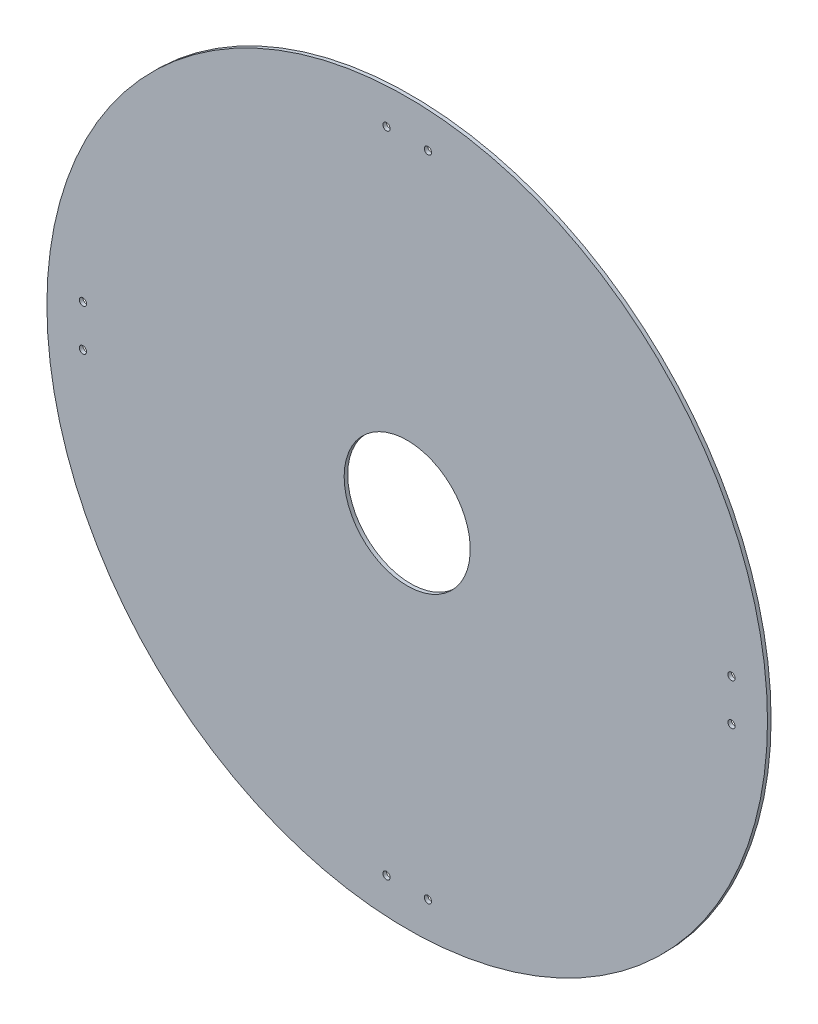
ISO-10303-21;
HEADER;
FILE_DESCRIPTION(('STEP AP214'),'2;1');
FILE_NAME('part.step','',(''),(''),'','','');
FILE_SCHEMA(('AUTOMOTIVE_DESIGN { 1 0 10303 214 1 1 1 1 }'));
ENDSEC;
DATA;
#1=APPLICATION_CONTEXT('core data for automotive mechanical design processes');
#2=APPLICATION_PROTOCOL_DEFINITION('international standard','automotive_design',2000,#1);
#3=PRODUCT_CONTEXT('',#1,'mechanical');
#4=PRODUCT('Part','Part','',(#3));
#5=PRODUCT_RELATED_PRODUCT_CATEGORY('part','',(#4));
#6=PRODUCT_DEFINITION_FORMATION('','',#4);
#7=PRODUCT_DEFINITION_CONTEXT('part definition',#1,'design');
#8=PRODUCT_DEFINITION('design','',#6,#7);
#9=PRODUCT_DEFINITION_SHAPE('','',#8);
#10=(LENGTH_UNIT() NAMED_UNIT(*) SI_UNIT(.MILLI.,.METRE.));
#11=(NAMED_UNIT(*) PLANE_ANGLE_UNIT() SI_UNIT($,.RADIAN.));
#12=(NAMED_UNIT(*) SI_UNIT($,.STERADIAN.) SOLID_ANGLE_UNIT());
#13=UNCERTAINTY_MEASURE_WITH_UNIT(LENGTH_MEASURE(1.E-05),#10,'distance_accuracy_value','');
#14=(GEOMETRIC_REPRESENTATION_CONTEXT(3) GLOBAL_UNCERTAINTY_ASSIGNED_CONTEXT((#13)) GLOBAL_UNIT_ASSIGNED_CONTEXT((#10,
#11,#12)) REPRESENTATION_CONTEXT('',''));
#15=CARTESIAN_POINT('',(0.,0.,0.));
#16=DIRECTION('',(0.,0.,1.));
#17=DIRECTION('',(1.,0.,0.));
#18=AXIS2_PLACEMENT_3D('',#15,#16,#17);
#19=CARTESIAN_POINT('',(0.,0.,2.));
#20=DIRECTION('',(0.,0.,-1.));
#21=DIRECTION('',(-1.,0.,0.));
#22=AXIS2_PLACEMENT_3D('',#19,#20,#21);
#23=CYLINDRICAL_SURFACE('',#22,200.);
#24=CARTESIAN_POINT('',(0.,0.,2.));
#25=DIRECTION('',(0.,0.,1.));
#26=DIRECTION('',(1.,0.,0.));
#27=AXIS2_PLACEMENT_3D('',#24,#25,#26);
#28=CIRCLE('',#27,200.);
#29=CARTESIAN_POINT('',(200.,0.,2.));
#30=VERTEX_POINT('',#29);
#31=EDGE_CURVE('E12',#30,#30,#28,.T.);
#32=ORIENTED_EDGE('',*,*,#31,.F.);
#33=EDGE_LOOP('',(#32));
#34=FACE_BOUND('',#33,.T.);
#35=CARTESIAN_POINT('',(0.,0.,0.));
#36=DIRECTION('',(0.,0.,1.));
#37=DIRECTION('',(1.,0.,0.));
#38=AXIS2_PLACEMENT_3D('',#35,#36,#37);
#39=CIRCLE('',#38,200.);
#40=CARTESIAN_POINT('',(200.,0.,0.));
#41=VERTEX_POINT('',#40);
#42=EDGE_CURVE('E47',#41,#41,#39,.T.);
#43=ORIENTED_EDGE('',*,*,#42,.T.);
#44=EDGE_LOOP('',(#43));
#45=FACE_BOUND('',#44,.T.);
#46=ADVANCED_FACE('F44',(#34,#45),#23,.T.);
#47=CARTESIAN_POINT('',(0.,0.,2.));
#48=DIRECTION('',(0.,0.,1.));
#49=DIRECTION('',(1.,0.,0.));
#50=AXIS2_PLACEMENT_3D('',#47,#48,#49);
#51=PLANE('',#50);
#52=CARTESIAN_POINT('',(0.,0.,2.));
#53=DIRECTION('',(0.,0.,-1.));
#54=DIRECTION('',(-1.,0.,0.));
#55=AXIS2_PLACEMENT_3D('',#52,#53,#54);
#56=CIRCLE('',#55,35.);
#57=CARTESIAN_POINT('',(-35.,0.,2.));
#58=VERTEX_POINT('',#57);
#59=EDGE_CURVE('E103',#58,#58,#56,.T.);
#60=ORIENTED_EDGE('',*,*,#59,.T.);
#61=EDGE_LOOP('',(#60));
#62=FACE_BOUND('',#61,.T.);
#63=CARTESIAN_POINT('',(180.,11.5000000000019,2.));
#64=DIRECTION('',(0.,0.,1.));
#65=DIRECTION('',(1.,0.,0.));
#66=AXIS2_PLACEMENT_3D('',#63,#64,#65);
#67=CIRCLE('',#66,2.);
#68=CARTESIAN_POINT('',(182.,11.5000000000019,2.));
#69=VERTEX_POINT('',#68);
#70=EDGE_CURVE('E65',#69,#69,#67,.T.);
#71=ORIENTED_EDGE('',*,*,#70,.F.);
#72=EDGE_LOOP('',(#71));
#73=FACE_BOUND('',#72,.T.);
#74=CARTESIAN_POINT('',(-11.5,-180.,2.));
#75=DIRECTION('',(0.,0.,1.));
#76=DIRECTION('',(1.,0.,0.));
#77=AXIS2_PLACEMENT_3D('',#74,#75,#76);
#78=CIRCLE('',#77,2.);
#79=CARTESIAN_POINT('',(-9.5,-180.,2.));
#80=VERTEX_POINT('',#79);
#81=EDGE_CURVE('E70',#80,#80,#78,.T.);
#82=ORIENTED_EDGE('',*,*,#81,.F.);
#83=EDGE_LOOP('',(#82));
#84=FACE_BOUND('',#83,.T.);
#85=CARTESIAN_POINT('',(11.5,-180.,2.));
#86=DIRECTION('',(0.,0.,1.));
#87=DIRECTION('',(1.,0.,0.));
#88=AXIS2_PLACEMENT_3D('',#85,#86,#87);
#89=CIRCLE('',#88,2.);
#90=CARTESIAN_POINT('',(13.5,-180.,2.));
#91=VERTEX_POINT('',#90);
#92=EDGE_CURVE('E73',#91,#91,#89,.T.);
#93=ORIENTED_EDGE('',*,*,#92,.F.);
#94=EDGE_LOOP('',(#93));
#95=FACE_BOUND('',#94,.T.);
#96=CARTESIAN_POINT('',(-180.,11.4999999999994,2.));
#97=DIRECTION('',(0.,0.,1.));
#98=DIRECTION('',(1.,0.,0.));
#99=AXIS2_PLACEMENT_3D('',#96,#97,#98);
#100=CIRCLE('',#99,2.);
#101=CARTESIAN_POINT('',(-178.,11.4999999999994,2.));
#102=VERTEX_POINT('',#101);
#103=EDGE_CURVE('E76',#102,#102,#100,.T.);
#104=ORIENTED_EDGE('',*,*,#103,.F.);
#105=EDGE_LOOP('',(#104));
#106=FACE_BOUND('',#105,.T.);
#107=CARTESIAN_POINT('',(180.,-11.4999999999981,2.));
#108=DIRECTION('',(0.,0.,1.));
#109=DIRECTION('',(1.,0.,0.));
#110=AXIS2_PLACEMENT_3D('',#107,#108,#109);
#111=CIRCLE('',#110,2.);
#112=CARTESIAN_POINT('',(182.,-11.4999999999981,2.));
#113=VERTEX_POINT('',#112);
#114=EDGE_CURVE('E79',#113,#113,#111,.T.);
#115=ORIENTED_EDGE('',*,*,#114,.F.);
#116=EDGE_LOOP('',(#115));
#117=FACE_BOUND('',#116,.T.);
#118=CARTESIAN_POINT('',(-180.,-11.5000000000006,2.));
#119=DIRECTION('',(0.,0.,1.));
#120=DIRECTION('',(1.,0.,0.));
#121=AXIS2_PLACEMENT_3D('',#118,#119,#120);
#122=CIRCLE('',#121,2.);
#123=CARTESIAN_POINT('',(-178.,-11.5000000000006,2.));
#124=VERTEX_POINT('',#123);
#125=EDGE_CURVE('E82',#124,#124,#122,.T.);
#126=ORIENTED_EDGE('',*,*,#125,.F.);
#127=EDGE_LOOP('',(#126));
#128=FACE_BOUND('',#127,.T.);
#129=CARTESIAN_POINT('',(-11.5,180.,2.));
#130=DIRECTION('',(0.,0.,1.));
#131=DIRECTION('',(1.,0.,0.));
#132=AXIS2_PLACEMENT_3D('',#129,#130,#131);
#133=CIRCLE('',#132,2.);
#134=CARTESIAN_POINT('',(-9.5,180.,2.));
#135=VERTEX_POINT('',#134);
#136=EDGE_CURVE('E54',#135,#135,#133,.T.);
#137=ORIENTED_EDGE('',*,*,#136,.F.);
#138=EDGE_LOOP('',(#137));
#139=FACE_BOUND('',#138,.T.);
#140=CARTESIAN_POINT('',(11.5,180.,2.));
#141=DIRECTION('',(0.,0.,1.));
#142=DIRECTION('',(1.,0.,0.));
#143=AXIS2_PLACEMENT_3D('',#140,#141,#142);
#144=CIRCLE('',#143,2.);
#145=CARTESIAN_POINT('',(13.5,180.,2.));
#146=VERTEX_POINT('',#145);
#147=EDGE_CURVE('E58',#146,#146,#144,.T.);
#148=ORIENTED_EDGE('',*,*,#147,.F.);
#149=EDGE_LOOP('',(#148));
#150=FACE_BOUND('',#149,.T.);
#151=ORIENTED_EDGE('',*,*,#31,.T.);
#152=EDGE_LOOP('',(#151));
#153=FACE_BOUND('',#152,.T.);
#154=ADVANCED_FACE('F110',(#62,#73,#84,#95,#106,#117,#128,#139,#150,#153),#51,.T.);
#155=CARTESIAN_POINT('',(0.,0.,0.));
#156=DIRECTION('',(0.,0.,1.));
#157=DIRECTION('',(1.,0.,0.));
#158=AXIS2_PLACEMENT_3D('',#155,#156,#157);
#159=PLANE('',#158);
#160=CARTESIAN_POINT('',(0.,0.,0.));
#161=DIRECTION('',(0.,0.,-1.));
#162=DIRECTION('',(-1.,0.,0.));
#163=AXIS2_PLACEMENT_3D('',#160,#161,#162);
#164=CIRCLE('',#163,35.);
#165=CARTESIAN_POINT('',(-35.,0.,0.));
#166=VERTEX_POINT('',#165);
#167=EDGE_CURVE('E104',#166,#166,#164,.T.);
#168=ORIENTED_EDGE('',*,*,#167,.F.);
#169=EDGE_LOOP('',(#168));
#170=FACE_BOUND('',#169,.T.);
#171=CARTESIAN_POINT('',(180.,11.5000000000019,0.));
#172=DIRECTION('',(0.,0.,-1.));
#173=DIRECTION('',(0.,1.,0.));
#174=AXIS2_PLACEMENT_3D('',#171,#172,#173);
#175=CIRCLE('',#174,2.);
#176=CARTESIAN_POINT('',(180.,13.5000000000019,0.));
#177=VERTEX_POINT('',#176);
#178=EDGE_CURVE('E95',#177,#177,#175,.T.);
#179=ORIENTED_EDGE('',*,*,#178,.F.);
#180=EDGE_LOOP('',(#179));
#181=FACE_BOUND('',#180,.T.);
#182=CARTESIAN_POINT('',(-11.5,-180.,0.));
#183=DIRECTION('',(0.,0.,-1.));
#184=DIRECTION('',(-1.,0.,0.));
#185=AXIS2_PLACEMENT_3D('',#182,#183,#184);
#186=CIRCLE('',#185,2.);
#187=CARTESIAN_POINT('',(-13.5,-180.,0.));
#188=VERTEX_POINT('',#187);
#189=EDGE_CURVE('E92',#188,#188,#186,.T.);
#190=ORIENTED_EDGE('',*,*,#189,.F.);
#191=EDGE_LOOP('',(#190));
#192=FACE_BOUND('',#191,.T.);
#193=CARTESIAN_POINT('',(11.5,-180.,0.));
#194=DIRECTION('',(0.,0.,-1.));
#195=DIRECTION('',(1.,0.,0.));
#196=AXIS2_PLACEMENT_3D('',#193,#194,#195);
#197=CIRCLE('',#196,2.);
#198=CARTESIAN_POINT('',(13.5,-180.,0.));
#199=VERTEX_POINT('',#198);
#200=EDGE_CURVE('E89',#199,#199,#197,.T.);
#201=ORIENTED_EDGE('',*,*,#200,.F.);
#202=EDGE_LOOP('',(#201));
#203=FACE_BOUND('',#202,.T.);
#204=CARTESIAN_POINT('',(-180.,11.4999999999994,0.));
#205=DIRECTION('',(0.,0.,-1.));
#206=DIRECTION('',(0.,1.,0.));
#207=AXIS2_PLACEMENT_3D('',#204,#205,#206);
#208=CIRCLE('',#207,2.);
#209=CARTESIAN_POINT('',(-180.,13.4999999999994,0.));
#210=VERTEX_POINT('',#209);
#211=EDGE_CURVE('E88',#210,#210,#208,.T.);
#212=ORIENTED_EDGE('',*,*,#211,.F.);
#213=EDGE_LOOP('',(#212));
#214=FACE_BOUND('',#213,.T.);
#215=CARTESIAN_POINT('',(180.,-11.4999999999981,0.));
#216=DIRECTION('',(0.,0.,-1.));
#217=DIRECTION('',(0.,-1.,0.));
#218=AXIS2_PLACEMENT_3D('',#215,#216,#217);
#219=CIRCLE('',#218,2.);
#220=CARTESIAN_POINT('',(180.,-13.4999999999981,0.));
#221=VERTEX_POINT('',#220);
#222=EDGE_CURVE('E98',#221,#221,#219,.T.);
#223=ORIENTED_EDGE('',*,*,#222,.F.);
#224=EDGE_LOOP('',(#223));
#225=FACE_BOUND('',#224,.T.);
#226=CARTESIAN_POINT('',(-180.,-11.5000000000006,0.));
#227=DIRECTION('',(0.,0.,-1.));
#228=DIRECTION('',(0.,-1.,0.));
#229=AXIS2_PLACEMENT_3D('',#226,#227,#228);
#230=CIRCLE('',#229,2.);
#231=CARTESIAN_POINT('',(-180.,-13.5000000000006,0.));
#232=VERTEX_POINT('',#231);
#233=EDGE_CURVE('E85',#232,#232,#230,.T.);
#234=ORIENTED_EDGE('',*,*,#233,.F.);
#235=EDGE_LOOP('',(#234));
#236=FACE_BOUND('',#235,.T.);
#237=CARTESIAN_POINT('',(-11.5,180.,0.));
#238=DIRECTION('',(0.,0.,-1.));
#239=DIRECTION('',(-1.,0.,0.));
#240=AXIS2_PLACEMENT_3D('',#237,#238,#239);
#241=CIRCLE('',#240,2.);
#242=CARTESIAN_POINT('',(-13.5,180.,0.));
#243=VERTEX_POINT('',#242);
#244=EDGE_CURVE('E61',#243,#243,#241,.T.);
#245=ORIENTED_EDGE('',*,*,#244,.F.);
#246=EDGE_LOOP('',(#245));
#247=FACE_BOUND('',#246,.T.);
#248=CARTESIAN_POINT('',(11.5,180.,0.));
#249=DIRECTION('',(0.,0.,-1.));
#250=DIRECTION('',(1.,0.,0.));
#251=AXIS2_PLACEMENT_3D('',#248,#249,#250);
#252=CIRCLE('',#251,2.);
#253=CARTESIAN_POINT('',(13.5,180.,0.));
#254=VERTEX_POINT('',#253);
#255=EDGE_CURVE('E62',#254,#254,#252,.T.);
#256=ORIENTED_EDGE('',*,*,#255,.F.);
#257=EDGE_LOOP('',(#256));
#258=FACE_BOUND('',#257,.T.);
#259=ORIENTED_EDGE('',*,*,#42,.F.);
#260=EDGE_LOOP('',(#259));
#261=FACE_BOUND('',#260,.T.);
#262=ADVANCED_FACE('F120',(#170,#181,#192,#203,#214,#225,#236,#247,#258,#261),#159,.F.);
#263=CARTESIAN_POINT('',(11.5,180.,13.));
#264=DIRECTION('',(0.,0.,-1.));
#265=DIRECTION('',(-1.,0.,0.));
#266=AXIS2_PLACEMENT_3D('',#263,#264,#265);
#267=CYLINDRICAL_SURFACE('',#266,2.);
#268=ORIENTED_EDGE('',*,*,#147,.T.);
#269=EDGE_LOOP('',(#268));
#270=FACE_BOUND('',#269,.T.);
#271=ORIENTED_EDGE('',*,*,#255,.T.);
#272=EDGE_LOOP('',(#271));
#273=FACE_BOUND('',#272,.T.);
#274=ADVANCED_FACE('F123',(#270,#273),#267,.F.);
#275=CARTESIAN_POINT('',(-11.5,180.,13.));
#276=DIRECTION('',(0.,0.,-1.));
#277=DIRECTION('',(-1.,0.,0.));
#278=AXIS2_PLACEMENT_3D('',#275,#276,#277);
#279=CYLINDRICAL_SURFACE('',#278,2.);
#280=ORIENTED_EDGE('',*,*,#136,.T.);
#281=EDGE_LOOP('',(#280));
#282=FACE_BOUND('',#281,.T.);
#283=ORIENTED_EDGE('',*,*,#244,.T.);
#284=EDGE_LOOP('',(#283));
#285=FACE_BOUND('',#284,.T.);
#286=ADVANCED_FACE('F153',(#282,#285),#279,.F.);
#287=CARTESIAN_POINT('',(-180.,-11.5000000000006,13.));
#288=DIRECTION('',(0.,0.,-1.));
#289=DIRECTION('',(-1.,0.,0.));
#290=AXIS2_PLACEMENT_3D('',#287,#288,#289);
#291=CYLINDRICAL_SURFACE('',#290,2.);
#292=ORIENTED_EDGE('',*,*,#125,.T.);
#293=EDGE_LOOP('',(#292));
#294=FACE_BOUND('',#293,.T.);
#295=ORIENTED_EDGE('',*,*,#233,.T.);
#296=EDGE_LOOP('',(#295));
#297=FACE_BOUND('',#296,.T.);
#298=ADVANCED_FACE('F157',(#294,#297),#291,.F.);
#299=CARTESIAN_POINT('',(180.,-11.4999999999981,13.));
#300=DIRECTION('',(0.,0.,-1.));
#301=DIRECTION('',(-1.,0.,0.));
#302=AXIS2_PLACEMENT_3D('',#299,#300,#301);
#303=CYLINDRICAL_SURFACE('',#302,2.);
#304=ORIENTED_EDGE('',*,*,#114,.T.);
#305=EDGE_LOOP('',(#304));
#306=FACE_BOUND('',#305,.T.);
#307=ORIENTED_EDGE('',*,*,#222,.T.);
#308=EDGE_LOOP('',(#307));
#309=FACE_BOUND('',#308,.T.);
#310=ADVANCED_FACE('F161',(#306,#309),#303,.F.);
#311=CARTESIAN_POINT('',(-180.,11.4999999999994,13.));
#312=DIRECTION('',(0.,0.,-1.));
#313=DIRECTION('',(-1.,0.,0.));
#314=AXIS2_PLACEMENT_3D('',#311,#312,#313);
#315=CYLINDRICAL_SURFACE('',#314,2.);
#316=ORIENTED_EDGE('',*,*,#103,.T.);
#317=EDGE_LOOP('',(#316));
#318=FACE_BOUND('',#317,.T.);
#319=ORIENTED_EDGE('',*,*,#211,.T.);
#320=EDGE_LOOP('',(#319));
#321=FACE_BOUND('',#320,.T.);
#322=ADVANCED_FACE('F167',(#318,#321),#315,.F.);
#323=CARTESIAN_POINT('',(11.5,-180.,13.));
#324=DIRECTION('',(0.,0.,-1.));
#325=DIRECTION('',(-1.,0.,0.));
#326=AXIS2_PLACEMENT_3D('',#323,#324,#325);
#327=CYLINDRICAL_SURFACE('',#326,2.);
#328=ORIENTED_EDGE('',*,*,#92,.T.);
#329=EDGE_LOOP('',(#328));
#330=FACE_BOUND('',#329,.T.);
#331=ORIENTED_EDGE('',*,*,#200,.T.);
#332=EDGE_LOOP('',(#331));
#333=FACE_BOUND('',#332,.T.);
#334=ADVANCED_FACE('F163',(#330,#333),#327,.F.);
#335=CARTESIAN_POINT('',(-11.5,-180.,13.));
#336=DIRECTION('',(0.,0.,-1.));
#337=DIRECTION('',(-1.,0.,0.));
#338=AXIS2_PLACEMENT_3D('',#335,#336,#337);
#339=CYLINDRICAL_SURFACE('',#338,2.);
#340=ORIENTED_EDGE('',*,*,#81,.T.);
#341=EDGE_LOOP('',(#340));
#342=FACE_BOUND('',#341,.T.);
#343=ORIENTED_EDGE('',*,*,#189,.T.);
#344=EDGE_LOOP('',(#343));
#345=FACE_BOUND('',#344,.T.);
#346=ADVANCED_FACE('F166',(#342,#345),#339,.F.);
#347=CARTESIAN_POINT('',(180.,11.5000000000019,13.));
#348=DIRECTION('',(0.,0.,-1.));
#349=DIRECTION('',(-1.,0.,0.));
#350=AXIS2_PLACEMENT_3D('',#347,#348,#349);
#351=CYLINDRICAL_SURFACE('',#350,2.);
#352=ORIENTED_EDGE('',*,*,#70,.T.);
#353=EDGE_LOOP('',(#352));
#354=FACE_BOUND('',#353,.T.);
#355=ORIENTED_EDGE('',*,*,#178,.T.);
#356=EDGE_LOOP('',(#355));
#357=FACE_BOUND('',#356,.T.);
#358=ADVANCED_FACE('F116',(#354,#357),#351,.F.);
#359=CARTESIAN_POINT('',(0.,0.,2.));
#360=DIRECTION('',(0.,0.,-1.));
#361=DIRECTION('',(-1.,0.,0.));
#362=AXIS2_PLACEMENT_3D('',#359,#360,#361);
#363=CYLINDRICAL_SURFACE('',#362,35.);
#364=ORIENTED_EDGE('',*,*,#59,.F.);
#365=EDGE_LOOP('',(#364));
#366=FACE_BOUND('',#365,.T.);
#367=ORIENTED_EDGE('',*,*,#167,.T.);
#368=EDGE_LOOP('',(#367));
#369=FACE_BOUND('',#368,.T.);
#370=ADVANCED_FACE('F113',(#366,#369),#363,.F.);
#371=CLOSED_SHELL('',(#46,#154,#262,#274,#286,#298,#310,#322,#334,#346,#358,#370));
#372=MANIFOLD_SOLID_BREP('B2',#371);
#373=ADVANCED_BREP_SHAPE_REPRESENTATION('',(#18,#372),#14);
#374=SHAPE_DEFINITION_REPRESENTATION(#9,#373);
ENDSEC;
END-ISO-10303-21;
